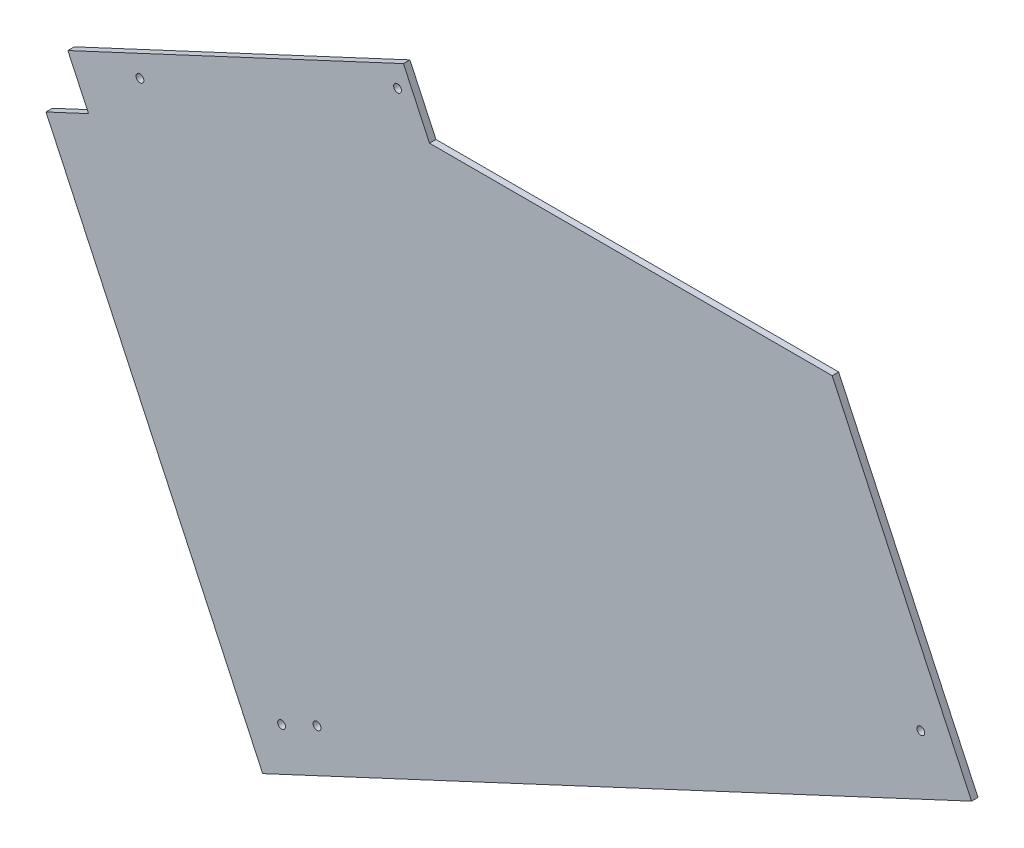
ISO-10303-21;
HEADER;
FILE_DESCRIPTION(('STEP AP214'),'2;1');
FILE_NAME('part.step','',(''),(''),'','','');
FILE_SCHEMA(('AUTOMOTIVE_DESIGN { 1 0 10303 214 1 1 1 1 }'));
ENDSEC;
DATA;
#1=APPLICATION_CONTEXT('core data for automotive mechanical design processes');
#2=APPLICATION_PROTOCOL_DEFINITION('international standard','automotive_design',2000,#1);
#3=PRODUCT_CONTEXT('',#1,'mechanical');
#4=PRODUCT('Part','Part','',(#3));
#5=PRODUCT_RELATED_PRODUCT_CATEGORY('part','',(#4));
#6=PRODUCT_DEFINITION_FORMATION('','',#4);
#7=PRODUCT_DEFINITION_CONTEXT('part definition',#1,'design');
#8=PRODUCT_DEFINITION('design','',#6,#7);
#9=PRODUCT_DEFINITION_SHAPE('','',#8);
#10=(LENGTH_UNIT() NAMED_UNIT(*) SI_UNIT(.MILLI.,.METRE.));
#11=(NAMED_UNIT(*) PLANE_ANGLE_UNIT() SI_UNIT($,.RADIAN.));
#12=(NAMED_UNIT(*) SI_UNIT($,.STERADIAN.) SOLID_ANGLE_UNIT());
#13=UNCERTAINTY_MEASURE_WITH_UNIT(LENGTH_MEASURE(1.E-05),#10,'distance_accuracy_value','');
#14=(GEOMETRIC_REPRESENTATION_CONTEXT(3) GLOBAL_UNCERTAINTY_ASSIGNED_CONTEXT((#13)) GLOBAL_UNIT_ASSIGNED_CONTEXT((#10,
#11,#12)) REPRESENTATION_CONTEXT('',''));
#15=CARTESIAN_POINT('',(0.,0.,0.));
#16=DIRECTION('',(0.,0.,1.));
#17=DIRECTION('',(1.,0.,0.));
#18=AXIS2_PLACEMENT_3D('',#15,#16,#17);
#19=CARTESIAN_POINT('',(0.,0.,0.));
#20=DIRECTION('',(0.,0.,1.));
#21=DIRECTION('',(1.,0.,0.));
#22=AXIS2_PLACEMENT_3D('',#19,#20,#21);
#23=PLANE('',#22);
#24=CARTESIAN_POINT('',(45.8517050815219,-295.293199148411,0.));
#25=DIRECTION('',(0.,0.,1.));
#26=DIRECTION('',(1.,0.,0.));
#27=AXIS2_PLACEMENT_3D('',#24,#25,#26);
#28=CIRCLE('',#27,2.);
#29=CARTESIAN_POINT('',(47.8517050815219,-295.293199148411,0.));
#30=VERTEX_POINT('',#29);
#31=EDGE_CURVE('E228',#30,#30,#28,.T.);
#32=ORIENTED_EDGE('',*,*,#31,.T.);
#33=EDGE_LOOP('',(#32));
#34=FACE_BOUND('',#33,.T.);
#35=CARTESIAN_POINT('',(63.9778608222549,-286.840833913597,0.));
#36=DIRECTION('',(0.,0.,1.));
#37=DIRECTION('',(1.,0.,0.));
#38=AXIS2_PLACEMENT_3D('',#35,#36,#37);
#39=CIRCLE('',#38,2.);
#40=CARTESIAN_POINT('',(65.9778608222549,-286.840833913597,0.));
#41=VERTEX_POINT('',#40);
#42=EDGE_CURVE('E230',#41,#41,#39,.T.);
#43=ORIENTED_EDGE('',*,*,#42,.T.);
#44=EDGE_LOOP('',(#43));
#45=FACE_BOUND('',#44,.T.);
#46=CARTESIAN_POINT('',(105.144723807752,16.1443903159115,0.));
#47=DIRECTION('',(0.,0.,1.));
#48=DIRECTION('',(1.,0.,0.));
#49=AXIS2_PLACEMENT_3D('',#46,#47,#48);
#50=CIRCLE('',#49,2.);
#51=CARTESIAN_POINT('',(107.144723807752,16.1443903159115,0.));
#52=VERTEX_POINT('',#51);
#53=EDGE_CURVE('E117',#52,#52,#50,.T.);
#54=ORIENTED_EDGE('',*,*,#53,.T.);
#55=EDGE_LOOP('',(#54));
#56=FACE_BOUND('',#55,.T.);
#57=CARTESIAN_POINT('',(-26.5934003567203,-45.2861058529553,0.));
#58=DIRECTION('',(0.,0.,1.));
#59=DIRECTION('',(1.,0.,0.));
#60=AXIS2_PLACEMENT_3D('',#57,#58,#59);
#61=CIRCLE('',#60,2.00000000000001);
#62=CARTESIAN_POINT('',(-24.5934003567203,-45.2861058529553,0.));
#63=VERTEX_POINT('',#62);
#64=EDGE_CURVE('E233',#63,#63,#61,.T.);
#65=ORIENTED_EDGE('',*,*,#64,.T.);
#66=EDGE_LOOP('',(#65));
#67=FACE_BOUND('',#66,.T.);
#68=DIRECTION('',(-0.422618261740698,0.906307787036651,0.));
#69=VECTOR('',#68,1.);
#70=CARTESIAN_POINT('',(398.701029390263,-152.824415427679,0.));
#71=LINE('',#70,#69);
#72=CARTESIAN_POINT('',(398.701029390263,-152.824415427679,0.));
#73=VERTEX_POINT('',#72);
#74=CARTESIAN_POINT('',(327.436217585211,0.00346667706761529,0.));
#75=VERTEX_POINT('',#74);
#76=EDGE_CURVE('E101',#73,#75,#71,.T.);
#77=ORIENTED_EDGE('',*,*,#76,.F.);
#78=DIRECTION('',(0.906307787036651,0.422618261740698,0.));
#79=VECTOR('',#78,1.);
#80=CARTESIAN_POINT('',(57.9293014644825,-311.728881842181,0.));
#81=LINE('',#80,#79);
#82=CARTESIAN_POINT('',(36.1779145756028,-321.871720123958,0.));
#83=VERTEX_POINT('',#82);
#84=EDGE_CURVE('E42',#83,#73,#81,.T.);
#85=ORIENTED_EDGE('',*,*,#84,.F.);
#86=DIRECTION('',(0.422618261740698,-0.906307787036651,0.));
#87=VECTOR('',#86,1.);
#88=CARTESIAN_POINT('',(36.1779145756028,-321.871720123958,0.));
#89=LINE('',#88,#87);
#90=CARTESIAN_POINT('',(-74.6325936528086,-84.2378183629475,0.));
#91=VERTEX_POINT('',#90);
#92=EDGE_CURVE('E134',#91,#83,#89,.T.);
#93=ORIENTED_EDGE('',*,*,#92,.F.);
#94=DIRECTION('',(-0.90630778703665,-0.422618261740699,0.));
#95=VECTOR('',#94,1.);
#96=CARTESIAN_POINT('',(-74.6325936528086,-84.2378183629475,0.));
#97=LINE('',#96,#95);
#98=CARTESIAN_POINT('',(-52.881206763929,-74.0949800811708,0.));
#99=VERTEX_POINT('',#98);
#100=EDGE_CURVE('E130',#99,#91,#97,.T.);
#101=ORIENTED_EDGE('',*,*,#100,.F.);
#102=DIRECTION('',(0.422618261740699,-0.90630778703665,0.));
#103=VECTOR('',#102,1.);
#104=CARTESIAN_POINT('',(-52.881206763929,-74.0949800811708,0.));
#105=LINE('',#104,#103);
#106=CARTESIAN_POINT('',(-63.4466633074466,-51.437285405254,0.));
#107=VERTEX_POINT('',#106);
#108=EDGE_CURVE('E126',#107,#99,#105,.T.);
#109=ORIENTED_EDGE('',*,*,#108,.F.);
#110=DIRECTION('',(-0.906307787036651,-0.422618261740697,0.));
#111=VECTOR('',#110,1.);
#112=CARTESIAN_POINT('',(108.169003486638,28.5884142802036,0.));
#113=LINE('',#112,#111);
#114=CARTESIAN_POINT('',(108.169003486638,28.5884142802036,0.));
#115=VERTEX_POINT('',#114);
#116=EDGE_CURVE('E122',#115,#107,#113,.T.);
#117=ORIENTED_EDGE('',*,*,#116,.F.);
#118=DIRECTION('',(-0.422618261740695,0.906307787036652,0.));
#119=VECTOR('',#118,1.);
#120=CARTESIAN_POINT('',(121.49838346194,0.00346667706759007,0.));
#121=LINE('',#120,#119);
#122=CARTESIAN_POINT('',(121.49838346194,0.00346667706759007,0.));
#123=VERTEX_POINT('',#122);
#124=EDGE_CURVE('E103',#123,#115,#121,.T.);
#125=ORIENTED_EDGE('',*,*,#124,.F.);
#126=DIRECTION('',(-1.,0.,0.));
#127=VECTOR('',#126,1.);
#128=CARTESIAN_POINT('',(327.436217585211,0.00346667706761529,0.));
#129=LINE('',#128,#127);
#130=EDGE_CURVE('E91',#75,#123,#129,.T.);
#131=ORIENTED_EDGE('',*,*,#130,.F.);
#132=EDGE_LOOP('',(#77,#85,#93,#101,#109,#117,#125,#131));
#133=FACE_BOUND('',#132,.T.);
#134=CARTESIAN_POINT('',(372.759364157214,-134.578319819674,0.));
#135=DIRECTION('',(0.,0.,1.));
#136=DIRECTION('',(1.,0.,0.));
#137=AXIS2_PLACEMENT_3D('',#134,#135,#136);
#138=CIRCLE('',#137,2.);
#139=CARTESIAN_POINT('',(374.759364157214,-134.578319819674,0.));
#140=VERTEX_POINT('',#139);
#141=EDGE_CURVE('E115',#140,#140,#138,.T.);
#142=ORIENTED_EDGE('',*,*,#141,.T.);
#143=EDGE_LOOP('',(#142));
#144=FACE_BOUND('',#143,.T.);
#145=ADVANCED_FACE('F33',(#34,#45,#56,#67,#133,#144),#23,.F.);
#146=CARTESIAN_POINT('',(398.701029390263,-152.824415427679,592.254178616354));
#147=DIRECTION('',(-0.90630778703665,-0.422618261740698,0.));
#148=DIRECTION('',(0.422618261740698,-0.906307787036651,0.));
#149=AXIS2_PLACEMENT_3D('',#146,#147,#148);
#150=PLANE('',#149);
#151=DIRECTION('',(0.,0.,-1.));
#152=VECTOR('',#151,1.);
#153=CARTESIAN_POINT('',(327.436217585211,0.00346667706761529,592.254178616354));
#154=LINE('',#153,#152);
#155=CARTESIAN_POINT('',(327.436217585211,0.00346667706761529,3.30000000000019));
#156=VERTEX_POINT('',#155);
#157=EDGE_CURVE('E88',#156,#75,#154,.T.);
#158=ORIENTED_EDGE('',*,*,#157,.F.);
#159=DIRECTION('',(0.422618261740698,-0.906307787036651,0.));
#160=VECTOR('',#159,1.);
#161=CARTESIAN_POINT('',(398.701029390263,-152.824415427679,3.30000000000019));
#162=LINE('',#161,#160);
#163=CARTESIAN_POINT('',(398.701029390263,-152.824415427679,3.3000000000002));
#164=VERTEX_POINT('',#163);
#165=EDGE_CURVE('E50',#156,#164,#162,.T.);
#166=ORIENTED_EDGE('',*,*,#165,.T.);
#167=DIRECTION('',(0.,0.,-1.));
#168=VECTOR('',#167,1.);
#169=CARTESIAN_POINT('',(398.701029390263,-152.824415427679,592.254178616354));
#170=LINE('',#169,#168);
#171=EDGE_CURVE('E108',#164,#73,#170,.T.);
#172=ORIENTED_EDGE('',*,*,#171,.T.);
#173=ORIENTED_EDGE('',*,*,#76,.T.);
#174=EDGE_LOOP('',(#158,#166,#172,#173));
#175=FACE_BOUND('',#174,.T.);
#176=ADVANCED_FACE('F106',(#175),#150,.F.);
#177=CARTESIAN_POINT('',(327.436217585211,0.00346667706761529,592.254178616354));
#178=DIRECTION('',(0.,-1.,0.));
#179=DIRECTION('',(1.,0.,0.));
#180=AXIS2_PLACEMENT_3D('',#177,#178,#179);
#181=PLANE('',#180);
#182=DIRECTION('',(0.,0.,-1.));
#183=VECTOR('',#182,1.);
#184=CARTESIAN_POINT('',(121.49838346194,0.00346667706759007,592.254178616354));
#185=LINE('',#184,#183);
#186=CARTESIAN_POINT('',(121.49838346194,0.00346667706759007,3.29999999999997));
#187=VERTEX_POINT('',#186);
#188=EDGE_CURVE('E83',#187,#123,#185,.T.);
#189=ORIENTED_EDGE('',*,*,#188,.F.);
#190=DIRECTION('',(1.,0.,0.));
#191=VECTOR('',#190,1.);
#192=CARTESIAN_POINT('',(327.436217585212,0.00346667706761529,3.30000000000019));
#193=LINE('',#192,#191);
#194=EDGE_CURVE('E93',#187,#156,#193,.T.);
#195=ORIENTED_EDGE('',*,*,#194,.T.);
#196=ORIENTED_EDGE('',*,*,#157,.T.);
#197=ORIENTED_EDGE('',*,*,#130,.T.);
#198=EDGE_LOOP('',(#189,#195,#196,#197));
#199=FACE_BOUND('',#198,.T.);
#200=ADVANCED_FACE('F90',(#199),#181,.F.);
#201=CARTESIAN_POINT('',(121.49838346194,0.00346667706759007,592.254178616354));
#202=DIRECTION('',(-0.906307787036652,-0.422618261740695,0.));
#203=DIRECTION('',(0.422618261740696,-0.906307787036652,0.));
#204=AXIS2_PLACEMENT_3D('',#201,#202,#203);
#205=PLANE('',#204);
#206=DIRECTION('',(0.,0.,-1.));
#207=VECTOR('',#206,1.);
#208=CARTESIAN_POINT('',(108.169003486638,28.5884142802036,592.254178616354));
#209=LINE('',#208,#207);
#210=CARTESIAN_POINT('',(108.169003486638,28.5884142802036,3.29999999999997));
#211=VERTEX_POINT('',#210);
#212=EDGE_CURVE('E120',#211,#115,#209,.T.);
#213=ORIENTED_EDGE('',*,*,#212,.F.);
#214=DIRECTION('',(0.422618261740696,-0.906307787036652,0.));
#215=VECTOR('',#214,1.);
#216=CARTESIAN_POINT('',(121.49838346194,0.00346667706747508,3.29999999999997));
#217=LINE('',#216,#215);
#218=EDGE_CURVE('E104',#211,#187,#217,.T.);
#219=ORIENTED_EDGE('',*,*,#218,.T.);
#220=ORIENTED_EDGE('',*,*,#188,.T.);
#221=ORIENTED_EDGE('',*,*,#124,.T.);
#222=EDGE_LOOP('',(#213,#219,#220,#221));
#223=FACE_BOUND('',#222,.T.);
#224=ADVANCED_FACE('F164',(#223),#205,.F.);
#225=CARTESIAN_POINT('',(108.169003486638,28.5884142802036,592.254178616354));
#226=DIRECTION('',(0.422618261740697,-0.906307787036651,0.));
#227=DIRECTION('',(0.906307787036651,0.422618261740697,0.));
#228=AXIS2_PLACEMENT_3D('',#225,#226,#227);
#229=PLANE('',#228);
#230=DIRECTION('',(0.,0.,-1.));
#231=VECTOR('',#230,1.);
#232=CARTESIAN_POINT('',(-63.4466633074466,-51.437285405254,592.254178616354));
#233=LINE('',#232,#231);
#234=CARTESIAN_POINT('',(-63.4466633074466,-51.437285405254,3.29999999999985));
#235=VERTEX_POINT('',#234);
#236=EDGE_CURVE('E124',#235,#107,#233,.T.);
#237=ORIENTED_EDGE('',*,*,#236,.F.);
#238=DIRECTION('',(0.906307787036651,0.422618261740697,0.));
#239=VECTOR('',#238,1.);
#240=CARTESIAN_POINT('',(108.169003486639,28.5884142802038,3.29999999999997));
#241=LINE('',#240,#239);
#242=EDGE_CURVE('E123',#235,#211,#241,.T.);
#243=ORIENTED_EDGE('',*,*,#242,.T.);
#244=ORIENTED_EDGE('',*,*,#212,.T.);
#245=ORIENTED_EDGE('',*,*,#116,.T.);
#246=EDGE_LOOP('',(#237,#243,#244,#245));
#247=FACE_BOUND('',#246,.T.);
#248=ADVANCED_FACE('F170',(#247),#229,.F.);
#249=CARTESIAN_POINT('',(-52.881206763929,-74.0949800811708,592.254178616354));
#250=DIRECTION('',(0.90630778703665,0.422618261740699,0.));
#251=DIRECTION('',(-0.422618261740699,0.90630778703665,0.));
#252=AXIS2_PLACEMENT_3D('',#249,#250,#251);
#253=PLANE('',#252);
#254=DIRECTION('',(0.,0.,-1.));
#255=VECTOR('',#254,1.);
#256=CARTESIAN_POINT('',(-52.881206763929,-74.0949800811708,592.254178616354));
#257=LINE('',#256,#255);
#258=CARTESIAN_POINT('',(-52.881206763929,-74.0949800811708,3.29999999999988));
#259=VERTEX_POINT('',#258);
#260=EDGE_CURVE('E128',#259,#99,#257,.T.);
#261=ORIENTED_EDGE('',*,*,#260,.F.);
#262=DIRECTION('',(-0.422618261740699,0.90630778703665,0.));
#263=VECTOR('',#262,1.);
#264=CARTESIAN_POINT('',(-52.8812067639289,-74.0949800811709,3.29999999999986));
#265=LINE('',#264,#263);
#266=EDGE_CURVE('E127',#259,#235,#265,.T.);
#267=ORIENTED_EDGE('',*,*,#266,.T.);
#268=ORIENTED_EDGE('',*,*,#236,.T.);
#269=ORIENTED_EDGE('',*,*,#108,.T.);
#270=EDGE_LOOP('',(#261,#267,#268,#269));
#271=FACE_BOUND('',#270,.T.);
#272=ADVANCED_FACE('F319',(#271),#253,.F.);
#273=CARTESIAN_POINT('',(-74.6325936528086,-84.2378183629475,592.254178616354));
#274=DIRECTION('',(0.422618261740699,-0.90630778703665,0.));
#275=DIRECTION('',(0.90630778703665,0.422618261740699,0.));
#276=AXIS2_PLACEMENT_3D('',#273,#274,#275);
#277=PLANE('',#276);
#278=DIRECTION('',(0.,0.,-1.));
#279=VECTOR('',#278,1.);
#280=CARTESIAN_POINT('',(-74.6325936528086,-84.2378183629475,592.254178616354));
#281=LINE('',#280,#279);
#282=CARTESIAN_POINT('',(-74.6325936528085,-84.2378183629476,3.2999999999998));
#283=VERTEX_POINT('',#282);
#284=EDGE_CURVE('E132',#283,#91,#281,.T.);
#285=ORIENTED_EDGE('',*,*,#284,.F.);
#286=DIRECTION('',(0.90630778703665,0.422618261740699,0.));
#287=VECTOR('',#286,1.);
#288=CARTESIAN_POINT('',(-74.6325936528081,-84.2378183629473,3.29999999999986));
#289=LINE('',#288,#287);
#290=EDGE_CURVE('E131',#283,#259,#289,.T.);
#291=ORIENTED_EDGE('',*,*,#290,.T.);
#292=ORIENTED_EDGE('',*,*,#260,.T.);
#293=ORIENTED_EDGE('',*,*,#100,.T.);
#294=EDGE_LOOP('',(#285,#291,#292,#293));
#295=FACE_BOUND('',#294,.T.);
#296=ADVANCED_FACE('F184',(#295),#277,.F.);
#297=CARTESIAN_POINT('',(36.1779145756028,-321.871720123958,592.254178616354));
#298=DIRECTION('',(0.906307787036651,0.422618261740698,0.));
#299=DIRECTION('',(-0.422618261740698,0.906307787036651,0.));
#300=AXIS2_PLACEMENT_3D('',#297,#298,#299);
#301=PLANE('',#300);
#302=DIRECTION('',(0.,0.,-1.));
#303=VECTOR('',#302,1.);
#304=CARTESIAN_POINT('',(36.1779145756028,-321.871720123958,592.254178616354));
#305=LINE('',#304,#303);
#306=CARTESIAN_POINT('',(36.1779145756028,-321.871720123958,3.29999999999997));
#307=VERTEX_POINT('',#306);
#308=EDGE_CURVE('E136',#307,#83,#305,.T.);
#309=ORIENTED_EDGE('',*,*,#308,.F.);
#310=DIRECTION('',(-0.422618261740698,0.906307787036651,0.));
#311=VECTOR('',#310,1.);
#312=CARTESIAN_POINT('',(36.1779145756028,-321.871720123958,3.29999999999986));
#313=LINE('',#312,#311);
#314=EDGE_CURVE('E135',#307,#283,#313,.T.);
#315=ORIENTED_EDGE('',*,*,#314,.T.);
#316=ORIENTED_EDGE('',*,*,#284,.T.);
#317=ORIENTED_EDGE('',*,*,#92,.T.);
#318=EDGE_LOOP('',(#309,#315,#316,#317));
#319=FACE_BOUND('',#318,.T.);
#320=ADVANCED_FACE('F185',(#319),#301,.F.);
#321=CARTESIAN_POINT('',(57.9293014644825,-311.728881842181,592.254178616354));
#322=DIRECTION('',(-0.422618261740698,0.90630778703665,0.));
#323=DIRECTION('',(-0.906307787036651,-0.422618261740698,0.));
#324=AXIS2_PLACEMENT_3D('',#321,#322,#323);
#325=PLANE('',#324);
#326=ORIENTED_EDGE('',*,*,#171,.F.);
#327=DIRECTION('',(-0.906307787036651,-0.422618261740698,0.));
#328=VECTOR('',#327,1.);
#329=CARTESIAN_POINT('',(57.929301464483,-311.728881842181,3.29999999999986));
#330=LINE('',#329,#328);
#331=EDGE_CURVE('E137',#164,#307,#330,.T.);
#332=ORIENTED_EDGE('',*,*,#331,.T.);
#333=ORIENTED_EDGE('',*,*,#308,.T.);
#334=ORIENTED_EDGE('',*,*,#84,.T.);
#335=EDGE_LOOP('',(#326,#332,#333,#334));
#336=FACE_BOUND('',#335,.T.);
#337=ADVANCED_FACE('F186',(#336),#325,.F.);
#338=CARTESIAN_POINT('',(372.759364157214,-134.578319819674,592.254178616354));
#339=DIRECTION('',(0.,0.,-1.));
#340=DIRECTION('',(-1.,0.,0.));
#341=AXIS2_PLACEMENT_3D('',#338,#339,#340);
#342=CYLINDRICAL_SURFACE('',#341,2.);
#343=CARTESIAN_POINT('',(372.759364157214,-134.578319819674,3.30000000000019));
#344=DIRECTION('',(0.,0.,-1.));
#345=DIRECTION('',(-1.,0.,0.));
#346=AXIS2_PLACEMENT_3D('',#343,#344,#345);
#347=CIRCLE('',#346,2.);
#348=CARTESIAN_POINT('',(370.759364157214,-134.578319819674,3.30000000000019));
#349=VERTEX_POINT('',#348);
#350=EDGE_CURVE('E11',#349,#349,#347,.T.);
#351=ORIENTED_EDGE('',*,*,#350,.F.);
#352=EDGE_LOOP('',(#351));
#353=FACE_BOUND('',#352,.T.);
#354=ORIENTED_EDGE('',*,*,#141,.F.);
#355=EDGE_LOOP('',(#354));
#356=FACE_BOUND('',#355,.T.);
#357=ADVANCED_FACE('F188',(#353,#356),#342,.F.);
#358=CARTESIAN_POINT('',(-44.8272945068599,-29.8454094916671,3.29999999999991));
#359=DIRECTION('',(0.,0.,-1.));
#360=DIRECTION('',(-0.90630778703665,-0.422618261740698,0.));
#361=AXIS2_PLACEMENT_3D('',#358,#359,#360);
#362=PLANE('',#361);
#363=CARTESIAN_POINT('',(45.8517050815219,-295.293199148411,3.29999999999996));
#364=DIRECTION('',(0.,0.,1.));
#365=DIRECTION('',(1.,0.,0.));
#366=AXIS2_PLACEMENT_3D('',#363,#364,#365);
#367=CIRCLE('',#366,2.);
#368=CARTESIAN_POINT('',(47.8517050815219,-295.293199148411,3.29999999999996));
#369=VERTEX_POINT('',#368);
#370=EDGE_CURVE('E226',#369,#369,#367,.T.);
#371=ORIENTED_EDGE('',*,*,#370,.F.);
#372=EDGE_LOOP('',(#371));
#373=FACE_BOUND('',#372,.T.);
#374=CARTESIAN_POINT('',(63.9778608222549,-286.840833913597,3.29999999999996));
#375=DIRECTION('',(0.,0.,1.));
#376=DIRECTION('',(1.,0.,0.));
#377=AXIS2_PLACEMENT_3D('',#374,#375,#376);
#378=CIRCLE('',#377,2.);
#379=CARTESIAN_POINT('',(65.9778608222549,-286.840833913597,3.29999999999996));
#380=VERTEX_POINT('',#379);
#381=EDGE_CURVE('E261',#380,#380,#378,.T.);
#382=ORIENTED_EDGE('',*,*,#381,.F.);
#383=EDGE_LOOP('',(#382));
#384=FACE_BOUND('',#383,.T.);
#385=CARTESIAN_POINT('',(105.144723807752,16.1443903159115,3.29999999999996));
#386=DIRECTION('',(0.,0.,1.));
#387=DIRECTION('',(1.,0.,0.));
#388=AXIS2_PLACEMENT_3D('',#385,#386,#387);
#389=CIRCLE('',#388,2.);
#390=CARTESIAN_POINT('',(107.144723807752,16.1443903159115,3.29999999999996));
#391=VERTEX_POINT('',#390);
#392=EDGE_CURVE('E240',#391,#391,#389,.T.);
#393=ORIENTED_EDGE('',*,*,#392,.F.);
#394=EDGE_LOOP('',(#393));
#395=FACE_BOUND('',#394,.T.);
#396=CARTESIAN_POINT('',(-26.5934003567203,-45.2861058529553,3.29999999999996));
#397=DIRECTION('',(0.,0.,1.));
#398=DIRECTION('',(1.,0.,0.));
#399=AXIS2_PLACEMENT_3D('',#396,#397,#398);
#400=CIRCLE('',#399,2.00000000000001);
#401=CARTESIAN_POINT('',(-24.5934003567203,-45.2861058529553,3.29999999999996));
#402=VERTEX_POINT('',#401);
#403=EDGE_CURVE('E229',#402,#402,#400,.T.);
#404=ORIENTED_EDGE('',*,*,#403,.F.);
#405=EDGE_LOOP('',(#404));
#406=FACE_BOUND('',#405,.T.);
#407=ORIENTED_EDGE('',*,*,#350,.T.);
#408=EDGE_LOOP('',(#407));
#409=FACE_BOUND('',#408,.T.);
#410=ORIENTED_EDGE('',*,*,#194,.F.);
#411=ORIENTED_EDGE('',*,*,#218,.F.);
#412=ORIENTED_EDGE('',*,*,#242,.F.);
#413=ORIENTED_EDGE('',*,*,#266,.F.);
#414=ORIENTED_EDGE('',*,*,#290,.F.);
#415=ORIENTED_EDGE('',*,*,#314,.F.);
#416=ORIENTED_EDGE('',*,*,#331,.F.);
#417=ORIENTED_EDGE('',*,*,#165,.F.);
#418=EDGE_LOOP('',(#410,#411,#412,#413,#414,#415,#416,#417));
#419=FACE_BOUND('',#418,.T.);
#420=ADVANCED_FACE('F35',(#373,#384,#395,#406,#409,#419),#362,.F.);
#421=CARTESIAN_POINT('',(-26.5934003567203,-45.2861058529553,0.));
#422=DIRECTION('',(0.,0.,1.));
#423=DIRECTION('',(1.,0.,0.));
#424=AXIS2_PLACEMENT_3D('',#421,#422,#423);
#425=CYLINDRICAL_SURFACE('',#424,2.00000000000001);
#426=ORIENTED_EDGE('',*,*,#64,.F.);
#427=EDGE_LOOP('',(#426));
#428=FACE_BOUND('',#427,.T.);
#429=ORIENTED_EDGE('',*,*,#403,.T.);
#430=EDGE_LOOP('',(#429));
#431=FACE_BOUND('',#430,.T.);
#432=ADVANCED_FACE('F206',(#428,#431),#425,.F.);
#433=CARTESIAN_POINT('',(105.144723807752,16.1443903159115,0.));
#434=DIRECTION('',(0.,0.,1.));
#435=DIRECTION('',(1.,0.,0.));
#436=AXIS2_PLACEMENT_3D('',#433,#434,#435);
#437=CYLINDRICAL_SURFACE('',#436,2.);
#438=ORIENTED_EDGE('',*,*,#53,.F.);
#439=EDGE_LOOP('',(#438));
#440=FACE_BOUND('',#439,.T.);
#441=ORIENTED_EDGE('',*,*,#392,.T.);
#442=EDGE_LOOP('',(#441));
#443=FACE_BOUND('',#442,.T.);
#444=ADVANCED_FACE('F209',(#440,#443),#437,.F.);
#445=CARTESIAN_POINT('',(63.9778608222549,-286.840833913597,-0.700000000000042));
#446=DIRECTION('',(0.,0.,1.));
#447=DIRECTION('',(1.,0.,0.));
#448=AXIS2_PLACEMENT_3D('',#445,#446,#447);
#449=CYLINDRICAL_SURFACE('',#448,2.);
#450=ORIENTED_EDGE('',*,*,#381,.T.);
#451=EDGE_LOOP('',(#450));
#452=FACE_BOUND('',#451,.T.);
#453=ORIENTED_EDGE('',*,*,#42,.F.);
#454=EDGE_LOOP('',(#453));
#455=FACE_BOUND('',#454,.T.);
#456=ADVANCED_FACE('F213',(#452,#455),#449,.F.);
#457=CARTESIAN_POINT('',(45.8517050815219,-295.293199148411,-0.700000000000042));
#458=DIRECTION('',(0.,0.,1.));
#459=DIRECTION('',(1.,0.,0.));
#460=AXIS2_PLACEMENT_3D('',#457,#458,#459);
#461=CYLINDRICAL_SURFACE('',#460,2.);
#462=ORIENTED_EDGE('',*,*,#370,.T.);
#463=EDGE_LOOP('',(#462));
#464=FACE_BOUND('',#463,.T.);
#465=ORIENTED_EDGE('',*,*,#31,.F.);
#466=EDGE_LOOP('',(#465));
#467=FACE_BOUND('',#466,.T.);
#468=ADVANCED_FACE('F217',(#464,#467),#461,.F.);
#469=CLOSED_SHELL('',(#145,#176,#200,#224,#248,#272,#296,#320,#337,#357,#420,#432,#444,#456,#468));
#470=MANIFOLD_SOLID_BREP('B2',#469);
#471=ADVANCED_BREP_SHAPE_REPRESENTATION('',(#18,#470),#14);
#472=SHAPE_DEFINITION_REPRESENTATION(#9,#471);
ENDSEC;
END-ISO-10303-21;
